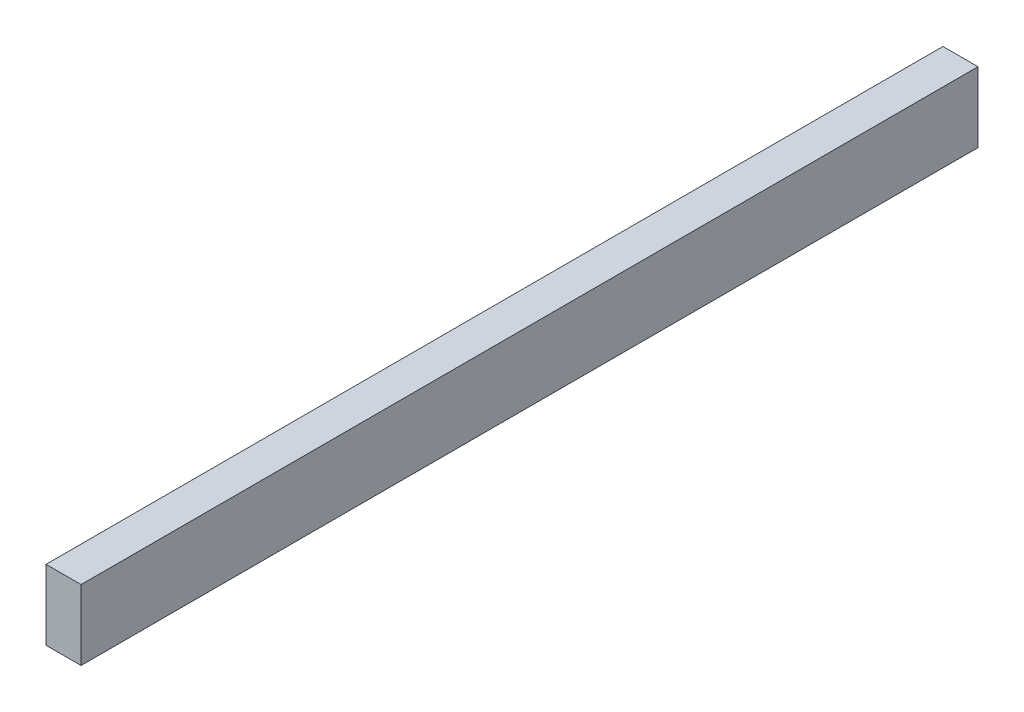
ISO-10303-21;
HEADER;
FILE_DESCRIPTION(('STEP AP214'),'2;1');
FILE_NAME('part.step','',(''),(''),'','','');
FILE_SCHEMA(('AUTOMOTIVE_DESIGN { 1 0 10303 214 1 1 1 1 }'));
ENDSEC;
DATA;
#1=APPLICATION_CONTEXT('core data for automotive mechanical design processes');
#2=APPLICATION_PROTOCOL_DEFINITION('international standard','automotive_design',2000,#1);
#3=PRODUCT_CONTEXT('',#1,'mechanical');
#4=PRODUCT('Part','Part','',(#3));
#5=PRODUCT_RELATED_PRODUCT_CATEGORY('part','',(#4));
#6=PRODUCT_DEFINITION_FORMATION('','',#4);
#7=PRODUCT_DEFINITION_CONTEXT('part definition',#1,'design');
#8=PRODUCT_DEFINITION('design','',#6,#7);
#9=PRODUCT_DEFINITION_SHAPE('','',#8);
#10=(LENGTH_UNIT() NAMED_UNIT(*) SI_UNIT(.MILLI.,.METRE.));
#11=(NAMED_UNIT(*) PLANE_ANGLE_UNIT() SI_UNIT($,.RADIAN.));
#12=(NAMED_UNIT(*) SI_UNIT($,.STERADIAN.) SOLID_ANGLE_UNIT());
#13=UNCERTAINTY_MEASURE_WITH_UNIT(LENGTH_MEASURE(1.E-05),#10,'distance_accuracy_value','');
#14=(GEOMETRIC_REPRESENTATION_CONTEXT(3) GLOBAL_UNCERTAINTY_ASSIGNED_CONTEXT((#13)) GLOBAL_UNIT_ASSIGNED_CONTEXT((#10,
#11,#12)) REPRESENTATION_CONTEXT('',''));
#15=CARTESIAN_POINT('',(0.,0.,0.));
#16=DIRECTION('',(0.,0.,1.));
#17=DIRECTION('',(1.,0.,0.));
#18=AXIS2_PLACEMENT_3D('',#15,#16,#17);
#19=CARTESIAN_POINT('',(0.,0.,1300.));
#20=DIRECTION('',(1.,0.,0.));
#21=DIRECTION('',(0.,0.,-1.));
#22=AXIS2_PLACEMENT_3D('',#19,#20,#21);
#23=PLANE('',#22);
#24=DIRECTION('',(0.,-1.,0.));
#25=VECTOR('',#24,1.);
#26=CARTESIAN_POINT('',(0.,0.,0.));
#27=LINE('',#26,#25);
#28=CARTESIAN_POINT('',(0.,101.6,0.));
#29=VERTEX_POINT('',#28);
#30=CARTESIAN_POINT('',(0.,0.,0.));
#31=VERTEX_POINT('',#30);
#32=EDGE_CURVE('E111',#29,#31,#27,.T.);
#33=ORIENTED_EDGE('',*,*,#32,.T.);
#34=DIRECTION('',(0.,0.,-1.));
#35=VECTOR('',#34,1.);
#36=CARTESIAN_POINT('',(0.,0.,1300.));
#37=LINE('',#36,#35);
#38=CARTESIAN_POINT('',(0.,0.,1300.));
#39=VERTEX_POINT('',#38);
#40=EDGE_CURVE('E11',#39,#31,#37,.T.);
#41=ORIENTED_EDGE('',*,*,#40,.F.);
#42=DIRECTION('',(0.,-1.,0.));
#43=VECTOR('',#42,1.);
#44=CARTESIAN_POINT('',(0.,0.,1300.));
#45=LINE('',#44,#43);
#46=CARTESIAN_POINT('',(0.,101.6,1300.));
#47=VERTEX_POINT('',#46);
#48=EDGE_CURVE('E95',#47,#39,#45,.T.);
#49=ORIENTED_EDGE('',*,*,#48,.F.);
#50=DIRECTION('',(0.,0.,-1.));
#51=VECTOR('',#50,1.);
#52=CARTESIAN_POINT('',(0.,101.6,1300.));
#53=LINE('',#52,#51);
#54=EDGE_CURVE('E107',#47,#29,#53,.T.);
#55=ORIENTED_EDGE('',*,*,#54,.T.);
#56=EDGE_LOOP('',(#33,#41,#49,#55));
#57=FACE_BOUND('',#56,.T.);
#58=ADVANCED_FACE('F43',(#57),#23,.F.);
#59=CARTESIAN_POINT('',(0.,0.,1300.));
#60=DIRECTION('',(0.,1.,0.));
#61=DIRECTION('',(0.,0.,1.));
#62=AXIS2_PLACEMENT_3D('',#59,#60,#61);
#63=PLANE('',#62);
#64=DIRECTION('',(1.,0.,0.));
#65=VECTOR('',#64,1.);
#66=CARTESIAN_POINT('',(0.,0.,0.));
#67=LINE('',#66,#65);
#68=CARTESIAN_POINT('',(50.8,0.,0.));
#69=VERTEX_POINT('',#68);
#70=EDGE_CURVE('E100',#31,#69,#67,.T.);
#71=ORIENTED_EDGE('',*,*,#70,.T.);
#72=DIRECTION('',(0.,0.,-1.));
#73=VECTOR('',#72,1.);
#74=CARTESIAN_POINT('',(50.8,0.,1300.));
#75=LINE('',#74,#73);
#76=CARTESIAN_POINT('',(50.8,0.,1300.));
#77=VERTEX_POINT('',#76);
#78=EDGE_CURVE('E52',#77,#69,#75,.T.);
#79=ORIENTED_EDGE('',*,*,#78,.F.);
#80=DIRECTION('',(1.,0.,0.));
#81=VECTOR('',#80,1.);
#82=CARTESIAN_POINT('',(0.,0.,1300.));
#83=LINE('',#82,#81);
#84=EDGE_CURVE('E90',#39,#77,#83,.T.);
#85=ORIENTED_EDGE('',*,*,#84,.F.);
#86=ORIENTED_EDGE('',*,*,#40,.T.);
#87=EDGE_LOOP('',(#71,#79,#85,#86));
#88=FACE_BOUND('',#87,.T.);
#89=ADVANCED_FACE('F99',(#88),#63,.F.);
#90=CARTESIAN_POINT('',(50.8,0.,1300.));
#91=DIRECTION('',(-1.,0.,0.));
#92=DIRECTION('',(0.,0.,1.));
#93=AXIS2_PLACEMENT_3D('',#90,#91,#92);
#94=PLANE('',#93);
#95=DIRECTION('',(0.,1.,0.));
#96=VECTOR('',#95,1.);
#97=CARTESIAN_POINT('',(50.8,0.,0.));
#98=LINE('',#97,#96);
#99=CARTESIAN_POINT('',(50.8,101.6,0.));
#100=VERTEX_POINT('',#99);
#101=EDGE_CURVE('E77',#69,#100,#98,.T.);
#102=ORIENTED_EDGE('',*,*,#101,.T.);
#103=DIRECTION('',(0.,0.,-1.));
#104=VECTOR('',#103,1.);
#105=CARTESIAN_POINT('',(50.8,101.6,1300.));
#106=LINE('',#105,#104);
#107=CARTESIAN_POINT('',(50.8,101.6,1300.));
#108=VERTEX_POINT('',#107);
#109=EDGE_CURVE('E102',#108,#100,#106,.T.);
#110=ORIENTED_EDGE('',*,*,#109,.F.);
#111=DIRECTION('',(0.,1.,0.));
#112=VECTOR('',#111,1.);
#113=CARTESIAN_POINT('',(50.8,0.,1300.));
#114=LINE('',#113,#112);
#115=EDGE_CURVE('E93',#77,#108,#114,.T.);
#116=ORIENTED_EDGE('',*,*,#115,.F.);
#117=ORIENTED_EDGE('',*,*,#78,.T.);
#118=EDGE_LOOP('',(#102,#110,#116,#117));
#119=FACE_BOUND('',#118,.T.);
#120=ADVANCED_FACE('F103',(#119),#94,.F.);
#121=CARTESIAN_POINT('',(0.,101.6,1300.));
#122=DIRECTION('',(0.,-1.,0.));
#123=DIRECTION('',(0.,0.,-1.));
#124=AXIS2_PLACEMENT_3D('',#121,#122,#123);
#125=PLANE('',#124);
#126=DIRECTION('',(-1.,0.,0.));
#127=VECTOR('',#126,1.);
#128=CARTESIAN_POINT('',(0.,101.6,0.));
#129=LINE('',#128,#127);
#130=EDGE_CURVE('E83',#100,#29,#129,.T.);
#131=ORIENTED_EDGE('',*,*,#130,.T.);
#132=ORIENTED_EDGE('',*,*,#54,.F.);
#133=DIRECTION('',(-1.,0.,0.));
#134=VECTOR('',#133,1.);
#135=CARTESIAN_POINT('',(0.,101.6,1300.));
#136=LINE('',#135,#134);
#137=EDGE_CURVE('E60',#108,#47,#136,.T.);
#138=ORIENTED_EDGE('',*,*,#137,.F.);
#139=ORIENTED_EDGE('',*,*,#109,.T.);
#140=EDGE_LOOP('',(#131,#132,#138,#139));
#141=FACE_BOUND('',#140,.T.);
#142=ADVANCED_FACE('F124',(#141),#125,.F.);
#143=CARTESIAN_POINT('',(0.,0.,1300.));
#144=DIRECTION('',(0.,0.,-1.));
#145=DIRECTION('',(-1.,0.,0.));
#146=AXIS2_PLACEMENT_3D('',#143,#144,#145);
#147=PLANE('',#146);
#148=ORIENTED_EDGE('',*,*,#48,.T.);
#149=ORIENTED_EDGE('',*,*,#84,.T.);
#150=ORIENTED_EDGE('',*,*,#115,.T.);
#151=ORIENTED_EDGE('',*,*,#137,.T.);
#152=EDGE_LOOP('',(#148,#149,#150,#151));
#153=FACE_BOUND('',#152,.T.);
#154=ADVANCED_FACE('F91',(#153),#147,.F.);
#155=CARTESIAN_POINT('',(0.,0.,0.));
#156=DIRECTION('',(0.,0.,-1.));
#157=DIRECTION('',(-1.,0.,0.));
#158=AXIS2_PLACEMENT_3D('',#155,#156,#157);
#159=PLANE('',#158);
#160=ORIENTED_EDGE('',*,*,#32,.F.);
#161=ORIENTED_EDGE('',*,*,#130,.F.);
#162=ORIENTED_EDGE('',*,*,#101,.F.);
#163=ORIENTED_EDGE('',*,*,#70,.F.);
#164=EDGE_LOOP('',(#160,#161,#162,#163));
#165=FACE_BOUND('',#164,.T.);
#166=ADVANCED_FACE('F127',(#165),#159,.T.);
#167=CLOSED_SHELL('',(#58,#89,#120,#142,#154,#166));
#168=MANIFOLD_SOLID_BREP('B2',#167);
#169=ADVANCED_BREP_SHAPE_REPRESENTATION('',(#18,#168),#14);
#170=SHAPE_DEFINITION_REPRESENTATION(#9,#169);
ENDSEC;
END-ISO-10303-21;
